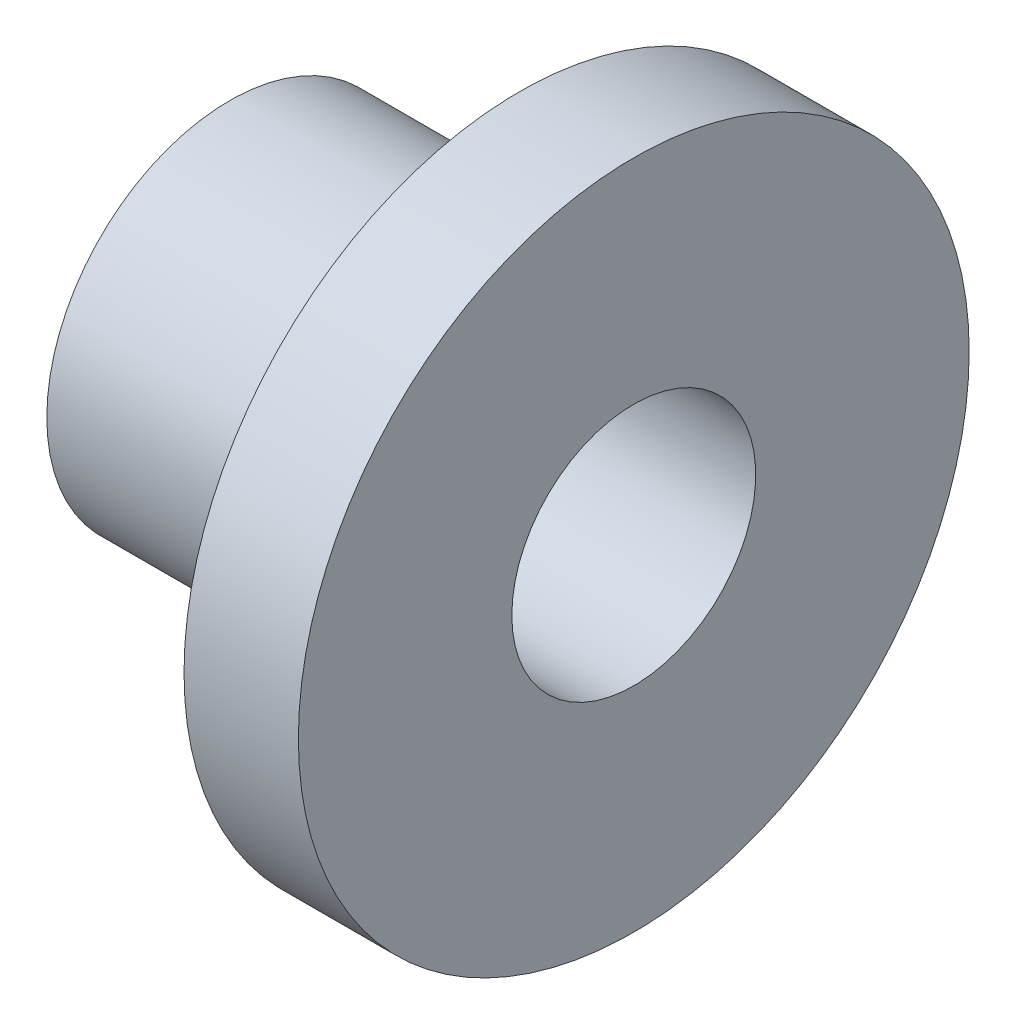
ISO-10303-21;
HEADER;
FILE_DESCRIPTION(('STEP AP214'),'2;1');
FILE_NAME('part.step','',(''),(''),'','','');
FILE_SCHEMA(('AUTOMOTIVE_DESIGN { 1 0 10303 214 1 1 1 1 }'));
ENDSEC;
DATA;
#1=APPLICATION_CONTEXT('core data for automotive mechanical design processes');
#2=APPLICATION_PROTOCOL_DEFINITION('international standard','automotive_design',2000,#1);
#3=PRODUCT_CONTEXT('',#1,'mechanical');
#4=PRODUCT('Part','Part','',(#3));
#5=PRODUCT_RELATED_PRODUCT_CATEGORY('part','',(#4));
#6=PRODUCT_DEFINITION_FORMATION('','',#4);
#7=PRODUCT_DEFINITION_CONTEXT('part definition',#1,'design');
#8=PRODUCT_DEFINITION('design','',#6,#7);
#9=PRODUCT_DEFINITION_SHAPE('','',#8);
#10=(LENGTH_UNIT() NAMED_UNIT(*) SI_UNIT(.MILLI.,.METRE.));
#11=(NAMED_UNIT(*) PLANE_ANGLE_UNIT() SI_UNIT($,.RADIAN.));
#12=(NAMED_UNIT(*) SI_UNIT($,.STERADIAN.) SOLID_ANGLE_UNIT());
#13=UNCERTAINTY_MEASURE_WITH_UNIT(LENGTH_MEASURE(1.E-05),#10,'distance_accuracy_value','');
#14=(GEOMETRIC_REPRESENTATION_CONTEXT(3) GLOBAL_UNCERTAINTY_ASSIGNED_CONTEXT((#13)) GLOBAL_UNIT_ASSIGNED_CONTEXT((#10,
#11,#12)) REPRESENTATION_CONTEXT('',''));
#15=CARTESIAN_POINT('',(0.,0.,0.));
#16=DIRECTION('',(0.,0.,1.));
#17=DIRECTION('',(1.,0.,0.));
#18=AXIS2_PLACEMENT_3D('',#15,#16,#17);
#19=CARTESIAN_POINT('',(0.,0.,0.));
#20=DIRECTION('',(-1.,0.,0.));
#21=DIRECTION('',(0.,0.,1.));
#22=AXIS2_PLACEMENT_3D('',#19,#20,#21);
#23=PLANE('',#22);
#24=CARTESIAN_POINT('',(0.,0.,0.));
#25=DIRECTION('',(-1.,0.,0.));
#26=DIRECTION('',(0.,0.,1.));
#27=AXIS2_PLACEMENT_3D('',#24,#25,#26);
#28=CIRCLE('',#27,2.4);
#29=CARTESIAN_POINT('',(0.,0.,2.4));
#30=VERTEX_POINT('',#29);
#31=EDGE_CURVE('E66',#30,#30,#28,.T.);
#32=ORIENTED_EDGE('',*,*,#31,.T.);
#33=EDGE_LOOP('',(#32));
#34=FACE_BOUND('',#33,.T.);
#35=CARTESIAN_POINT('',(0.,0.,0.));
#36=DIRECTION('',(-1.,0.,0.));
#37=DIRECTION('',(0.,0.,1.));
#38=AXIS2_PLACEMENT_3D('',#35,#36,#37);
#39=CIRCLE('',#38,1.6);
#40=CARTESIAN_POINT('',(0.,0.,1.6));
#41=VERTEX_POINT('',#40);
#42=EDGE_CURVE('E10',#41,#41,#39,.T.);
#43=ORIENTED_EDGE('',*,*,#42,.F.);
#44=EDGE_LOOP('',(#43));
#45=FACE_BOUND('',#44,.T.);
#46=ADVANCED_FACE('F39',(#34,#45),#23,.T.);
#47=CARTESIAN_POINT('',(0.,0.,0.));
#48=DIRECTION('',(-1.,0.,0.));
#49=DIRECTION('',(0.,0.,1.));
#50=AXIS2_PLACEMENT_3D('',#47,#48,#49);
#51=CYLINDRICAL_SURFACE('',#50,1.6);
#52=CARTESIAN_POINT('',(5.3,0.,0.));
#53=DIRECTION('',(-1.,0.,0.));
#54=DIRECTION('',(0.,0.,1.));
#55=AXIS2_PLACEMENT_3D('',#52,#53,#54);
#56=CIRCLE('',#55,1.6);
#57=CARTESIAN_POINT('',(5.3,0.,1.6));
#58=VERTEX_POINT('',#57);
#59=EDGE_CURVE('E46',#58,#58,#56,.T.);
#60=ORIENTED_EDGE('',*,*,#59,.F.);
#61=EDGE_LOOP('',(#60));
#62=FACE_BOUND('',#61,.T.);
#63=ORIENTED_EDGE('',*,*,#42,.T.);
#64=EDGE_LOOP('',(#63));
#65=FACE_BOUND('',#64,.T.);
#66=ADVANCED_FACE('F85',(#62,#65),#51,.F.);
#67=CARTESIAN_POINT('',(5.3,0.,0.));
#68=DIRECTION('',(-1.,0.,0.));
#69=DIRECTION('',(0.,0.,1.));
#70=AXIS2_PLACEMENT_3D('',#67,#68,#69);
#71=PLANE('',#70);
#72=CARTESIAN_POINT('',(5.3,0.,0.));
#73=DIRECTION('',(-1.,0.,0.));
#74=DIRECTION('',(0.,0.,1.));
#75=AXIS2_PLACEMENT_3D('',#72,#73,#74);
#76=CIRCLE('',#75,4.4);
#77=CARTESIAN_POINT('',(5.3,0.,4.4));
#78=VERTEX_POINT('',#77);
#79=EDGE_CURVE('E51',#78,#78,#76,.T.);
#80=ORIENTED_EDGE('',*,*,#79,.F.);
#81=EDGE_LOOP('',(#80));
#82=FACE_BOUND('',#81,.T.);
#83=ORIENTED_EDGE('',*,*,#59,.T.);
#84=EDGE_LOOP('',(#83));
#85=FACE_BOUND('',#84,.T.);
#86=ADVANCED_FACE('F89',(#82,#85),#71,.F.);
#87=CARTESIAN_POINT('',(0.,0.,0.));
#88=DIRECTION('',(-1.,0.,0.));
#89=DIRECTION('',(0.,0.,1.));
#90=AXIS2_PLACEMENT_3D('',#87,#88,#89);
#91=CYLINDRICAL_SURFACE('',#90,4.4);
#92=CARTESIAN_POINT('',(3.8,0.,0.));
#93=DIRECTION('',(-1.,0.,0.));
#94=DIRECTION('',(0.,0.,1.));
#95=AXIS2_PLACEMENT_3D('',#92,#93,#94);
#96=CIRCLE('',#95,4.4);
#97=CARTESIAN_POINT('',(3.8,0.,4.4));
#98=VERTEX_POINT('',#97);
#99=EDGE_CURVE('E56',#98,#98,#96,.T.);
#100=ORIENTED_EDGE('',*,*,#99,.F.);
#101=EDGE_LOOP('',(#100));
#102=FACE_BOUND('',#101,.T.);
#103=ORIENTED_EDGE('',*,*,#79,.T.);
#104=EDGE_LOOP('',(#103));
#105=FACE_BOUND('',#104,.T.);
#106=ADVANCED_FACE('F81',(#102,#105),#91,.T.);
#107=CARTESIAN_POINT('',(3.8,0.,0.));
#108=DIRECTION('',(-1.,0.,0.));
#109=DIRECTION('',(0.,0.,1.));
#110=AXIS2_PLACEMENT_3D('',#107,#108,#109);
#111=PLANE('',#110);
#112=ORIENTED_EDGE('',*,*,#99,.T.);
#113=EDGE_LOOP('',(#112));
#114=FACE_BOUND('',#113,.T.);
#115=CARTESIAN_POINT('',(3.8,0.,0.));
#116=DIRECTION('',(-1.,0.,0.));
#117=DIRECTION('',(0.,0.,1.));
#118=AXIS2_PLACEMENT_3D('',#115,#116,#117);
#119=CIRCLE('',#118,2.4);
#120=CARTESIAN_POINT('',(3.8,0.,2.4));
#121=VERTEX_POINT('',#120);
#122=EDGE_CURVE('E62',#121,#121,#119,.T.);
#123=ORIENTED_EDGE('',*,*,#122,.F.);
#124=EDGE_LOOP('',(#123));
#125=FACE_BOUND('',#124,.T.);
#126=ADVANCED_FACE('F75',(#114,#125),#111,.T.);
#127=CARTESIAN_POINT('',(0.,0.,0.));
#128=DIRECTION('',(-1.,0.,0.));
#129=DIRECTION('',(0.,0.,1.));
#130=AXIS2_PLACEMENT_3D('',#127,#128,#129);
#131=CYLINDRICAL_SURFACE('',#130,2.4);
#132=ORIENTED_EDGE('',*,*,#122,.T.);
#133=EDGE_LOOP('',(#132));
#134=FACE_BOUND('',#133,.T.);
#135=ORIENTED_EDGE('',*,*,#31,.F.);
#136=EDGE_LOOP('',(#135));
#137=FACE_BOUND('',#136,.T.);
#138=ADVANCED_FACE('F73',(#134,#137),#131,.T.);
#139=CLOSED_SHELL('',(#46,#66,#86,#106,#126,#138));
#140=MANIFOLD_SOLID_BREP('B2',#139);
#141=ADVANCED_BREP_SHAPE_REPRESENTATION('',(#18,#140),#14);
#142=SHAPE_DEFINITION_REPRESENTATION(#9,#141);
ENDSEC;
END-ISO-10303-21;
